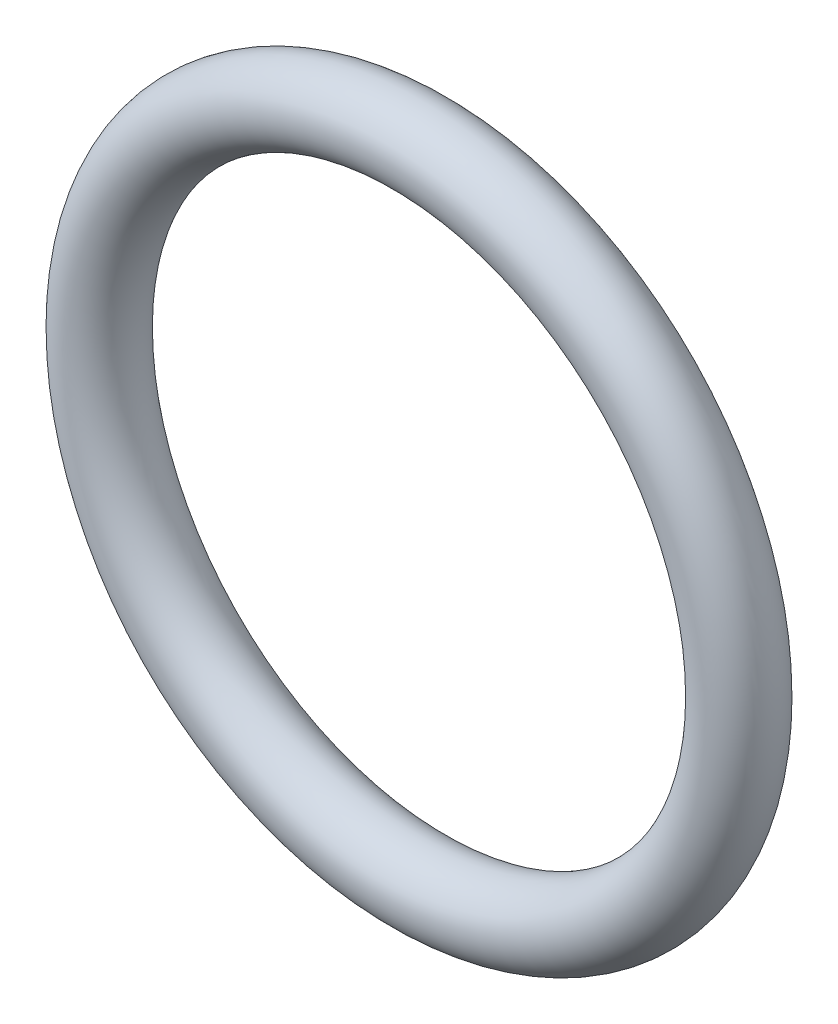
ISO-10303-21;
HEADER;
FILE_DESCRIPTION(('STEP AP214'),'2;1');
FILE_NAME('part.step','',(''),(''),'','','');
FILE_SCHEMA(('AUTOMOTIVE_DESIGN { 1 0 10303 214 1 1 1 1 }'));
ENDSEC;
DATA;
#1=APPLICATION_CONTEXT('core data for automotive mechanical design processes');
#2=APPLICATION_PROTOCOL_DEFINITION('international standard','automotive_design',2000,#1);
#3=PRODUCT_CONTEXT('',#1,'mechanical');
#4=PRODUCT('Part','Part','',(#3));
#5=PRODUCT_RELATED_PRODUCT_CATEGORY('part','',(#4));
#6=PRODUCT_DEFINITION_FORMATION('','',#4);
#7=PRODUCT_DEFINITION_CONTEXT('part definition',#1,'design');
#8=PRODUCT_DEFINITION('design','',#6,#7);
#9=PRODUCT_DEFINITION_SHAPE('','',#8);
#10=(LENGTH_UNIT() NAMED_UNIT(*) SI_UNIT(.MILLI.,.METRE.));
#11=(NAMED_UNIT(*) PLANE_ANGLE_UNIT() SI_UNIT($,.RADIAN.));
#12=(NAMED_UNIT(*) SI_UNIT($,.STERADIAN.) SOLID_ANGLE_UNIT());
#13=UNCERTAINTY_MEASURE_WITH_UNIT(LENGTH_MEASURE(1.E-05),#10,'distance_accuracy_value','');
#14=(GEOMETRIC_REPRESENTATION_CONTEXT(3) GLOBAL_UNCERTAINTY_ASSIGNED_CONTEXT((#13)) GLOBAL_UNIT_ASSIGNED_CONTEXT((#10,
#11,#12)) REPRESENTATION_CONTEXT('',''));
#15=CARTESIAN_POINT('',(0.,0.,0.));
#16=DIRECTION('',(0.,0.,1.));
#17=DIRECTION('',(1.,0.,0.));
#18=AXIS2_PLACEMENT_3D('',#15,#16,#17);
#19=CARTESIAN_POINT('',(0.,0.,0.));
#20=DIRECTION('',(0.,0.,1.));
#21=DIRECTION('',(1.,0.,0.));
#22=AXIS2_PLACEMENT_3D('',#19,#20,#21);
#23=TOROIDAL_SURFACE('',#22,8.5,1.);
#24=CARTESIAN_POINT('',(9.5,0.,0.));
#25=VERTEX_POINT('',#24);
#26=VERTEX_LOOP('',#25);
#27=FACE_BOUND('',#26,.T.);
#28=ADVANCED_FACE('F28',(#27),#23,.T.);
#29=CLOSED_SHELL('',(#28));
#30=MANIFOLD_SOLID_BREP('B2',#29);
#31=ADVANCED_BREP_SHAPE_REPRESENTATION('',(#18,#30),#14);
#32=SHAPE_DEFINITION_REPRESENTATION(#9,#31);
ENDSEC;
END-ISO-10303-21;
